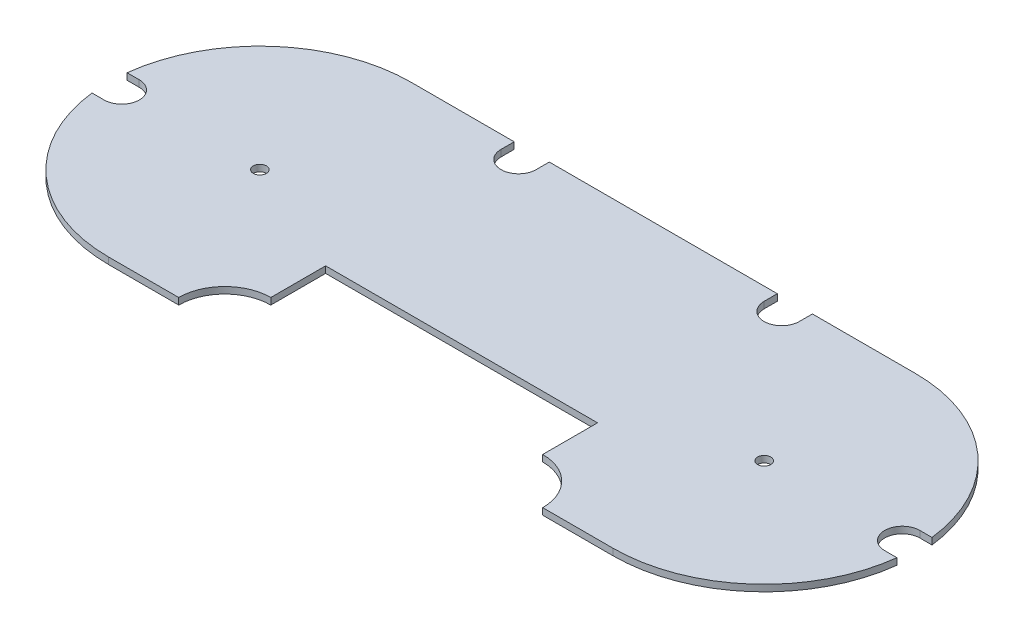
ISO-10303-21;
HEADER;
FILE_DESCRIPTION(('STEP AP214'),'2;1');
FILE_NAME('part.step','',(''),(''),'','','');
FILE_SCHEMA(('AUTOMOTIVE_DESIGN { 1 0 10303 214 1 1 1 1 }'));
ENDSEC;
DATA;
#1=APPLICATION_CONTEXT('core data for automotive mechanical design processes');
#2=APPLICATION_PROTOCOL_DEFINITION('international standard','automotive_design',2000,#1);
#3=PRODUCT_CONTEXT('',#1,'mechanical');
#4=PRODUCT('Part','Part','',(#3));
#5=PRODUCT_RELATED_PRODUCT_CATEGORY('part','',(#4));
#6=PRODUCT_DEFINITION_FORMATION('','',#4);
#7=PRODUCT_DEFINITION_CONTEXT('part definition',#1,'design');
#8=PRODUCT_DEFINITION('design','',#6,#7);
#9=PRODUCT_DEFINITION_SHAPE('','',#8);
#10=(LENGTH_UNIT() NAMED_UNIT(*) SI_UNIT(.MILLI.,.METRE.));
#11=(NAMED_UNIT(*) PLANE_ANGLE_UNIT() SI_UNIT($,.RADIAN.));
#12=(NAMED_UNIT(*) SI_UNIT($,.STERADIAN.) SOLID_ANGLE_UNIT());
#13=UNCERTAINTY_MEASURE_WITH_UNIT(LENGTH_MEASURE(1.E-05),#10,'distance_accuracy_value','');
#14=(GEOMETRIC_REPRESENTATION_CONTEXT(3) GLOBAL_UNCERTAINTY_ASSIGNED_CONTEXT((#13)) GLOBAL_UNIT_ASSIGNED_CONTEXT((#10,
#11,#12)) REPRESENTATION_CONTEXT('',''));
#15=CARTESIAN_POINT('',(0.,0.,0.));
#16=DIRECTION('',(0.,0.,1.));
#17=DIRECTION('',(1.,0.,0.));
#18=AXIS2_PLACEMENT_3D('',#15,#16,#17);
#19=CARTESIAN_POINT('',(30.,1.5,-31.5));
#20=DIRECTION('',(0.,-1.,0.));
#21=DIRECTION('',(0.,0.,-1.));
#22=AXIS2_PLACEMENT_3D('',#19,#20,#21);
#23=PLANE('',#22);
#24=DIRECTION('',(-1.,0.,0.));
#25=VECTOR('',#24,1.);
#26=CARTESIAN_POINT('',(0.,1.5,-34.5));
#27=LINE('',#26,#25);
#28=CARTESIAN_POINT('',(26.,1.5,-34.5));
#29=VERTEX_POINT('',#28);
#30=CARTESIAN_POINT('',(-26.,1.5,-34.5));
#31=VERTEX_POINT('',#30);
#32=EDGE_CURVE('E146',#29,#31,#27,.T.);
#33=ORIENTED_EDGE('',*,*,#32,.T.);
#34=DIRECTION('',(0.,0.,1.));
#35=VECTOR('',#34,1.);
#36=CARTESIAN_POINT('',(-26.,1.5,-31.5));
#37=LINE('',#36,#35);
#38=CARTESIAN_POINT('',(-26.,1.5,-31.5));
#39=VERTEX_POINT('',#38);
#40=EDGE_CURVE('E427',#31,#39,#37,.T.);
#41=ORIENTED_EDGE('',*,*,#40,.T.);
#42=CARTESIAN_POINT('',(-30.,1.5,-31.5));
#43=DIRECTION('',(0.,-1.,0.));
#44=DIRECTION('',(0.,0.,-1.));
#45=AXIS2_PLACEMENT_3D('',#42,#43,#44);
#46=CIRCLE('',#45,4.);
#47=CARTESIAN_POINT('',(-34.,1.5,-31.5));
#48=VERTEX_POINT('',#47);
#49=EDGE_CURVE('E358',#39,#48,#46,.T.);
#50=ORIENTED_EDGE('',*,*,#49,.T.);
#51=DIRECTION('',(0.,0.,-1.));
#52=VECTOR('',#51,1.);
#53=CARTESIAN_POINT('',(-34.,1.5,-34.5));
#54=LINE('',#53,#52);
#55=CARTESIAN_POINT('',(-34.,1.5,-34.5));
#56=VERTEX_POINT('',#55);
#57=EDGE_CURVE('E377',#48,#56,#54,.T.);
#58=ORIENTED_EDGE('',*,*,#57,.T.);
#59=DIRECTION('',(-1.,0.,0.));
#60=VECTOR('',#59,1.);
#61=CARTESIAN_POINT('',(-34.,1.5,-34.5));
#62=LINE('',#61,#60);
#63=CARTESIAN_POINT('',(-57.5,1.5,-34.5));
#64=VERTEX_POINT('',#63);
#65=EDGE_CURVE('E374',#56,#64,#62,.T.);
#66=ORIENTED_EDGE('',*,*,#65,.T.);
#67=CARTESIAN_POINT('',(-57.5,1.5,0.));
#68=DIRECTION('',(0.,1.,0.));
#69=DIRECTION('',(0.,0.,1.));
#70=AXIS2_PLACEMENT_3D('',#67,#68,#69);
#71=CIRCLE('',#70,34.5);
#72=CARTESIAN_POINT('',(-91.7673313813609,1.5,-4.00000000000002));
#73=VERTEX_POINT('',#72);
#74=EDGE_CURVE('E376',#64,#73,#71,.T.);
#75=ORIENTED_EDGE('',*,*,#74,.T.);
#76=DIRECTION('',(1.,0.,0.));
#77=VECTOR('',#76,1.);
#78=CARTESIAN_POINT('',(-91.7673313813609,1.5,-4.));
#79=LINE('',#78,#77);
#80=CARTESIAN_POINT('',(-89.,1.5,-4.));
#81=VERTEX_POINT('',#80);
#82=EDGE_CURVE('E379',#73,#81,#79,.T.);
#83=ORIENTED_EDGE('',*,*,#82,.T.);
#84=CARTESIAN_POINT('',(-89.,1.5,0.));
#85=DIRECTION('',(0.,-1.,0.));
#86=DIRECTION('',(0.,0.,-1.));
#87=AXIS2_PLACEMENT_3D('',#84,#85,#86);
#88=CIRCLE('',#87,4.);
#89=CARTESIAN_POINT('',(-89.,1.5,4.));
#90=VERTEX_POINT('',#89);
#91=EDGE_CURVE('E385',#81,#90,#88,.T.);
#92=ORIENTED_EDGE('',*,*,#91,.T.);
#93=DIRECTION('',(-1.,0.,0.));
#94=VECTOR('',#93,1.);
#95=CARTESIAN_POINT('',(-91.7673313813609,1.5,4.));
#96=LINE('',#95,#94);
#97=CARTESIAN_POINT('',(-91.7673313813609,1.5,4.));
#98=VERTEX_POINT('',#97);
#99=EDGE_CURVE('E387',#90,#98,#96,.T.);
#100=ORIENTED_EDGE('',*,*,#99,.T.);
#101=CARTESIAN_POINT('',(-57.5,1.5,0.));
#102=DIRECTION('',(0.,1.,0.));
#103=DIRECTION('',(0.,0.,1.));
#104=AXIS2_PLACEMENT_3D('',#101,#102,#103);
#105=CIRCLE('',#104,34.5);
#106=CARTESIAN_POINT('',(-57.5,1.5,34.5));
#107=VERTEX_POINT('',#106);
#108=EDGE_CURVE('E389',#98,#107,#105,.T.);
#109=ORIENTED_EDGE('',*,*,#108,.T.);
#110=DIRECTION('',(1.,0.,0.));
#111=VECTOR('',#110,1.);
#112=CARTESIAN_POINT('',(-57.5,1.5,34.5));
#113=LINE('',#112,#111);
#114=CARTESIAN_POINT('',(-41.5,1.5,34.5));
#115=VERTEX_POINT('',#114);
#116=EDGE_CURVE('E391',#107,#115,#113,.T.);
#117=ORIENTED_EDGE('',*,*,#116,.T.);
#118=CARTESIAN_POINT('',(-31.,1.5,34.5));
#119=DIRECTION('',(0.,-1.,0.));
#120=DIRECTION('',(0.,0.,-1.));
#121=AXIS2_PLACEMENT_3D('',#118,#119,#120);
#122=CIRCLE('',#121,10.5);
#123=CARTESIAN_POINT('',(-31.,1.5,24.));
#124=VERTEX_POINT('',#123);
#125=EDGE_CURVE('E393',#115,#124,#122,.T.);
#126=ORIENTED_EDGE('',*,*,#125,.T.);
#127=DIRECTION('',(0.,0.,-1.));
#128=VECTOR('',#127,1.);
#129=CARTESIAN_POINT('',(-31.,1.5,24.));
#130=LINE('',#129,#128);
#131=CARTESIAN_POINT('',(-31.,1.5,11.5));
#132=VERTEX_POINT('',#131);
#133=EDGE_CURVE('E395',#124,#132,#130,.T.);
#134=ORIENTED_EDGE('',*,*,#133,.T.);
#135=DIRECTION('',(1.,0.,0.));
#136=VECTOR('',#135,1.);
#137=CARTESIAN_POINT('',(-31.,1.5,11.5));
#138=LINE('',#137,#136);
#139=CARTESIAN_POINT('',(31.,1.5,11.5));
#140=VERTEX_POINT('',#139);
#141=EDGE_CURVE('E397',#132,#140,#138,.T.);
#142=ORIENTED_EDGE('',*,*,#141,.T.);
#143=DIRECTION('',(0.,0.,1.));
#144=VECTOR('',#143,1.);
#145=CARTESIAN_POINT('',(31.,1.5,11.5));
#146=LINE('',#145,#144);
#147=CARTESIAN_POINT('',(31.,1.5,24.));
#148=VERTEX_POINT('',#147);
#149=EDGE_CURVE('E399',#140,#148,#146,.T.);
#150=ORIENTED_EDGE('',*,*,#149,.T.);
#151=CARTESIAN_POINT('',(31.,1.5,34.5));
#152=DIRECTION('',(0.,-1.,0.));
#153=DIRECTION('',(0.,0.,-1.));
#154=AXIS2_PLACEMENT_3D('',#151,#152,#153);
#155=CIRCLE('',#154,10.5);
#156=CARTESIAN_POINT('',(41.5,1.5,34.5));
#157=VERTEX_POINT('',#156);
#158=EDGE_CURVE('E401',#148,#157,#155,.T.);
#159=ORIENTED_EDGE('',*,*,#158,.T.);
#160=DIRECTION('',(1.,0.,0.));
#161=VECTOR('',#160,1.);
#162=CARTESIAN_POINT('',(41.5,1.5,34.5));
#163=LINE('',#162,#161);
#164=CARTESIAN_POINT('',(57.5,1.5,34.5));
#165=VERTEX_POINT('',#164);
#166=EDGE_CURVE('E403',#157,#165,#163,.T.);
#167=ORIENTED_EDGE('',*,*,#166,.T.);
#168=CARTESIAN_POINT('',(57.5,1.5,0.));
#169=DIRECTION('',(0.,1.,0.));
#170=DIRECTION('',(0.,0.,-1.));
#171=AXIS2_PLACEMENT_3D('',#168,#169,#170);
#172=CIRCLE('',#171,34.5);
#173=CARTESIAN_POINT('',(91.7673313813609,1.5,4.));
#174=VERTEX_POINT('',#173);
#175=EDGE_CURVE('E405',#165,#174,#172,.T.);
#176=ORIENTED_EDGE('',*,*,#175,.T.);
#177=DIRECTION('',(-1.,0.,0.));
#178=VECTOR('',#177,1.);
#179=CARTESIAN_POINT('',(91.7673313813609,1.5,4.));
#180=LINE('',#179,#178);
#181=CARTESIAN_POINT('',(89.,1.5,4.));
#182=VERTEX_POINT('',#181);
#183=EDGE_CURVE('E407',#174,#182,#180,.T.);
#184=ORIENTED_EDGE('',*,*,#183,.T.);
#185=CARTESIAN_POINT('',(89.,1.5,0.));
#186=DIRECTION('',(0.,-1.,0.));
#187=DIRECTION('',(0.,0.,1.));
#188=AXIS2_PLACEMENT_3D('',#185,#186,#187);
#189=CIRCLE('',#188,4.);
#190=CARTESIAN_POINT('',(89.,1.5,-4.));
#191=VERTEX_POINT('',#190);
#192=EDGE_CURVE('E409',#182,#191,#189,.T.);
#193=ORIENTED_EDGE('',*,*,#192,.T.);
#194=DIRECTION('',(1.,0.,0.));
#195=VECTOR('',#194,1.);
#196=CARTESIAN_POINT('',(91.7673313813609,1.5,-4.));
#197=LINE('',#196,#195);
#198=CARTESIAN_POINT('',(91.7673313813609,1.5,-4.));
#199=VERTEX_POINT('',#198);
#200=EDGE_CURVE('E411',#191,#199,#197,.T.);
#201=ORIENTED_EDGE('',*,*,#200,.T.);
#202=CARTESIAN_POINT('',(57.5,1.5,0.));
#203=DIRECTION('',(0.,1.,0.));
#204=DIRECTION('',(0.,0.,-1.));
#205=AXIS2_PLACEMENT_3D('',#202,#203,#204);
#206=CIRCLE('',#205,34.5);
#207=CARTESIAN_POINT('',(57.5,1.5,-34.5));
#208=VERTEX_POINT('',#207);
#209=EDGE_CURVE('E413',#199,#208,#206,.T.);
#210=ORIENTED_EDGE('',*,*,#209,.T.);
#211=DIRECTION('',(-1.,0.,0.));
#212=VECTOR('',#211,1.);
#213=CARTESIAN_POINT('',(34.,1.5,-34.5));
#214=LINE('',#213,#212);
#215=CARTESIAN_POINT('',(34.,1.5,-34.5));
#216=VERTEX_POINT('',#215);
#217=EDGE_CURVE('E220',#208,#216,#214,.T.);
#218=ORIENTED_EDGE('',*,*,#217,.T.);
#219=DIRECTION('',(0.,0.,1.));
#220=VECTOR('',#219,1.);
#221=CARTESIAN_POINT('',(34.,1.5,-34.5));
#222=LINE('',#221,#220);
#223=CARTESIAN_POINT('',(34.,1.5,-31.5));
#224=VERTEX_POINT('',#223);
#225=EDGE_CURVE('E214',#216,#224,#222,.T.);
#226=ORIENTED_EDGE('',*,*,#225,.T.);
#227=CARTESIAN_POINT('',(30.,1.5,-31.5));
#228=DIRECTION('',(0.,-1.,0.));
#229=DIRECTION('',(0.,0.,-1.));
#230=AXIS2_PLACEMENT_3D('',#227,#228,#229);
#231=CIRCLE('',#230,4.);
#232=CARTESIAN_POINT('',(26.,1.5,-31.5));
#233=VERTEX_POINT('',#232);
#234=EDGE_CURVE('E218',#224,#233,#231,.T.);
#235=ORIENTED_EDGE('',*,*,#234,.T.);
#236=DIRECTION('',(0.,0.,-1.));
#237=VECTOR('',#236,1.);
#238=CARTESIAN_POINT('',(26.,1.5,-34.5));
#239=LINE('',#238,#237);
#240=EDGE_CURVE('E50',#233,#29,#239,.T.);
#241=ORIENTED_EDGE('',*,*,#240,.T.);
#242=EDGE_LOOP('',(#33,#41,#50,#58,#66,#75,#83,#92,#100,#109,#117,#126,#134,#142,#150,#159,#167,
#176,#184,#193,#201,#210,#218,#226,#235,#241));
#243=FACE_BOUND('',#242,.T.);
#244=CARTESIAN_POINT('',(-57.5,1.5,0.));
#245=DIRECTION('',(0.,1.,0.));
#246=DIRECTION('',(0.,0.,1.));
#247=AXIS2_PLACEMENT_3D('',#244,#245,#246);
#248=CIRCLE('',#247,1.5);
#249=CARTESIAN_POINT('',(-57.5,1.5,1.5));
#250=VERTEX_POINT('',#249);
#251=EDGE_CURVE('E240',#250,#250,#248,.T.);
#252=ORIENTED_EDGE('',*,*,#251,.F.);
#253=EDGE_LOOP('',(#252));
#254=FACE_BOUND('',#253,.T.);
#255=CARTESIAN_POINT('',(57.5,1.5,0.));
#256=DIRECTION('',(0.,1.,0.));
#257=DIRECTION('',(0.,0.,1.));
#258=AXIS2_PLACEMENT_3D('',#255,#256,#257);
#259=CIRCLE('',#258,1.5);
#260=CARTESIAN_POINT('',(57.5,1.5,1.49999999999997));
#261=VERTEX_POINT('',#260);
#262=EDGE_CURVE('E715',#261,#261,#259,.T.);
#263=ORIENTED_EDGE('',*,*,#262,.F.);
#264=EDGE_LOOP('',(#263));
#265=FACE_BOUND('',#264,.T.);
#266=ADVANCED_FACE('F33',(#243,#254,#265),#23,.F.);
#267=CARTESIAN_POINT('',(30.,0.,-31.5));
#268=DIRECTION('',(0.,-1.,0.));
#269=DIRECTION('',(0.,0.,-1.));
#270=AXIS2_PLACEMENT_3D('',#267,#268,#269);
#271=PLANE('',#270);
#272=CARTESIAN_POINT('',(-57.5,0.,0.));
#273=DIRECTION('',(0.,1.,0.));
#274=DIRECTION('',(0.,0.,1.));
#275=AXIS2_PLACEMENT_3D('',#272,#273,#274);
#276=CIRCLE('',#275,1.5);
#277=CARTESIAN_POINT('',(-57.5,0.,1.5));
#278=VERTEX_POINT('',#277);
#279=EDGE_CURVE('E431',#278,#278,#276,.T.);
#280=ORIENTED_EDGE('',*,*,#279,.T.);
#281=EDGE_LOOP('',(#280));
#282=FACE_BOUND('',#281,.T.);
#283=DIRECTION('',(-1.,0.,0.));
#284=VECTOR('',#283,1.);
#285=CARTESIAN_POINT('',(0.,0.,-34.5));
#286=LINE('',#285,#284);
#287=CARTESIAN_POINT('',(26.,0.,-34.5));
#288=VERTEX_POINT('',#287);
#289=CARTESIAN_POINT('',(-26.,0.,-34.5));
#290=VERTEX_POINT('',#289);
#291=EDGE_CURVE('E140',#288,#290,#286,.T.);
#292=ORIENTED_EDGE('',*,*,#291,.F.);
#293=DIRECTION('',(0.,0.,-1.));
#294=VECTOR('',#293,1.);
#295=CARTESIAN_POINT('',(26.,0.,-34.5));
#296=LINE('',#295,#294);
#297=CARTESIAN_POINT('',(26.,0.,-31.5));
#298=VERTEX_POINT('',#297);
#299=EDGE_CURVE('E286',#298,#288,#296,.T.);
#300=ORIENTED_EDGE('',*,*,#299,.F.);
#301=CARTESIAN_POINT('',(30.,0.,-31.5));
#302=DIRECTION('',(0.,-1.,0.));
#303=DIRECTION('',(0.,0.,-1.));
#304=AXIS2_PLACEMENT_3D('',#301,#302,#303);
#305=CIRCLE('',#304,4.);
#306=CARTESIAN_POINT('',(34.,0.,-31.5));
#307=VERTEX_POINT('',#306);
#308=EDGE_CURVE('E133',#307,#298,#305,.T.);
#309=ORIENTED_EDGE('',*,*,#308,.F.);
#310=DIRECTION('',(0.,0.,1.));
#311=VECTOR('',#310,1.);
#312=CARTESIAN_POINT('',(34.,0.,-34.5));
#313=LINE('',#312,#311);
#314=CARTESIAN_POINT('',(34.,0.,-34.5));
#315=VERTEX_POINT('',#314);
#316=EDGE_CURVE('E228',#315,#307,#313,.T.);
#317=ORIENTED_EDGE('',*,*,#316,.F.);
#318=DIRECTION('',(-1.,0.,0.));
#319=VECTOR('',#318,1.);
#320=CARTESIAN_POINT('',(34.,0.,-34.5));
#321=LINE('',#320,#319);
#322=CARTESIAN_POINT('',(57.5,0.,-34.5));
#323=VERTEX_POINT('',#322);
#324=EDGE_CURVE('E282',#323,#315,#321,.T.);
#325=ORIENTED_EDGE('',*,*,#324,.F.);
#326=CARTESIAN_POINT('',(57.5,0.,0.));
#327=DIRECTION('',(0.,1.,0.));
#328=DIRECTION('',(0.,0.,-1.));
#329=AXIS2_PLACEMENT_3D('',#326,#327,#328);
#330=CIRCLE('',#329,34.5);
#331=CARTESIAN_POINT('',(91.7673313813609,0.,-4.));
#332=VERTEX_POINT('',#331);
#333=EDGE_CURVE('E280',#332,#323,#330,.T.);
#334=ORIENTED_EDGE('',*,*,#333,.F.);
#335=DIRECTION('',(1.,0.,0.));
#336=VECTOR('',#335,1.);
#337=CARTESIAN_POINT('',(91.7673313813609,0.,-4.));
#338=LINE('',#337,#336);
#339=CARTESIAN_POINT('',(89.,0.,-4.));
#340=VERTEX_POINT('',#339);
#341=EDGE_CURVE('E278',#340,#332,#338,.T.);
#342=ORIENTED_EDGE('',*,*,#341,.F.);
#343=CARTESIAN_POINT('',(89.,0.,0.));
#344=DIRECTION('',(0.,-1.,0.));
#345=DIRECTION('',(0.,0.,1.));
#346=AXIS2_PLACEMENT_3D('',#343,#344,#345);
#347=CIRCLE('',#346,4.);
#348=CARTESIAN_POINT('',(89.,0.,4.));
#349=VERTEX_POINT('',#348);
#350=EDGE_CURVE('E276',#349,#340,#347,.T.);
#351=ORIENTED_EDGE('',*,*,#350,.F.);
#352=DIRECTION('',(-1.,0.,0.));
#353=VECTOR('',#352,1.);
#354=CARTESIAN_POINT('',(91.7673313813609,0.,4.));
#355=LINE('',#354,#353);
#356=CARTESIAN_POINT('',(91.7673313813609,0.,4.));
#357=VERTEX_POINT('',#356);
#358=EDGE_CURVE('E274',#357,#349,#355,.T.);
#359=ORIENTED_EDGE('',*,*,#358,.F.);
#360=CARTESIAN_POINT('',(57.5,0.,0.));
#361=DIRECTION('',(0.,1.,0.));
#362=DIRECTION('',(0.,0.,-1.));
#363=AXIS2_PLACEMENT_3D('',#360,#361,#362);
#364=CIRCLE('',#363,34.5);
#365=CARTESIAN_POINT('',(57.5,0.,34.5));
#366=VERTEX_POINT('',#365);
#367=EDGE_CURVE('E272',#366,#357,#364,.T.);
#368=ORIENTED_EDGE('',*,*,#367,.F.);
#369=DIRECTION('',(1.,0.,0.));
#370=VECTOR('',#369,1.);
#371=CARTESIAN_POINT('',(41.5,0.,34.5));
#372=LINE('',#371,#370);
#373=CARTESIAN_POINT('',(41.5,0.,34.5));
#374=VERTEX_POINT('',#373);
#375=EDGE_CURVE('E270',#374,#366,#372,.T.);
#376=ORIENTED_EDGE('',*,*,#375,.F.);
#377=CARTESIAN_POINT('',(31.,0.,34.5));
#378=DIRECTION('',(0.,-1.,0.));
#379=DIRECTION('',(0.,0.,-1.));
#380=AXIS2_PLACEMENT_3D('',#377,#378,#379);
#381=CIRCLE('',#380,10.5);
#382=CARTESIAN_POINT('',(31.,0.,24.));
#383=VERTEX_POINT('',#382);
#384=EDGE_CURVE('E268',#383,#374,#381,.T.);
#385=ORIENTED_EDGE('',*,*,#384,.F.);
#386=DIRECTION('',(0.,0.,1.));
#387=VECTOR('',#386,1.);
#388=CARTESIAN_POINT('',(31.,0.,11.5));
#389=LINE('',#388,#387);
#390=CARTESIAN_POINT('',(31.,0.,11.5));
#391=VERTEX_POINT('',#390);
#392=EDGE_CURVE('E266',#391,#383,#389,.T.);
#393=ORIENTED_EDGE('',*,*,#392,.F.);
#394=DIRECTION('',(1.,0.,0.));
#395=VECTOR('',#394,1.);
#396=CARTESIAN_POINT('',(-31.,0.,11.5));
#397=LINE('',#396,#395);
#398=CARTESIAN_POINT('',(-31.,0.,11.5));
#399=VERTEX_POINT('',#398);
#400=EDGE_CURVE('E264',#399,#391,#397,.T.);
#401=ORIENTED_EDGE('',*,*,#400,.F.);
#402=DIRECTION('',(0.,0.,-1.));
#403=VECTOR('',#402,1.);
#404=CARTESIAN_POINT('',(-31.,0.,24.));
#405=LINE('',#404,#403);
#406=CARTESIAN_POINT('',(-31.,0.,24.));
#407=VERTEX_POINT('',#406);
#408=EDGE_CURVE('E262',#407,#399,#405,.T.);
#409=ORIENTED_EDGE('',*,*,#408,.F.);
#410=CARTESIAN_POINT('',(-31.,0.,34.5));
#411=DIRECTION('',(0.,-1.,0.));
#412=DIRECTION('',(0.,0.,-1.));
#413=AXIS2_PLACEMENT_3D('',#410,#411,#412);
#414=CIRCLE('',#413,10.5);
#415=CARTESIAN_POINT('',(-41.5,0.,34.5));
#416=VERTEX_POINT('',#415);
#417=EDGE_CURVE('E260',#416,#407,#414,.T.);
#418=ORIENTED_EDGE('',*,*,#417,.F.);
#419=DIRECTION('',(1.,0.,0.));
#420=VECTOR('',#419,1.);
#421=CARTESIAN_POINT('',(-57.5,0.,34.5));
#422=LINE('',#421,#420);
#423=CARTESIAN_POINT('',(-57.5,0.,34.5));
#424=VERTEX_POINT('',#423);
#425=EDGE_CURVE('E258',#424,#416,#422,.T.);
#426=ORIENTED_EDGE('',*,*,#425,.F.);
#427=CARTESIAN_POINT('',(-57.5,0.,0.));
#428=DIRECTION('',(0.,1.,0.));
#429=DIRECTION('',(0.,0.,1.));
#430=AXIS2_PLACEMENT_3D('',#427,#428,#429);
#431=CIRCLE('',#430,34.5);
#432=CARTESIAN_POINT('',(-91.7673313813609,0.,4.));
#433=VERTEX_POINT('',#432);
#434=EDGE_CURVE('E256',#433,#424,#431,.T.);
#435=ORIENTED_EDGE('',*,*,#434,.F.);
#436=DIRECTION('',(-1.,0.,0.));
#437=VECTOR('',#436,1.);
#438=CARTESIAN_POINT('',(-91.7673313813609,0.,4.));
#439=LINE('',#438,#437);
#440=CARTESIAN_POINT('',(-89.,0.,4.));
#441=VERTEX_POINT('',#440);
#442=EDGE_CURVE('E254',#441,#433,#439,.T.);
#443=ORIENTED_EDGE('',*,*,#442,.F.);
#444=CARTESIAN_POINT('',(-89.,0.,0.));
#445=DIRECTION('',(0.,-1.,0.));
#446=DIRECTION('',(0.,0.,-1.));
#447=AXIS2_PLACEMENT_3D('',#444,#445,#446);
#448=CIRCLE('',#447,4.);
#449=CARTESIAN_POINT('',(-89.,0.,-4.));
#450=VERTEX_POINT('',#449);
#451=EDGE_CURVE('E252',#450,#441,#448,.T.);
#452=ORIENTED_EDGE('',*,*,#451,.F.);
#453=DIRECTION('',(1.,0.,0.));
#454=VECTOR('',#453,1.);
#455=CARTESIAN_POINT('',(-91.7673313813609,0.,-4.));
#456=LINE('',#455,#454);
#457=CARTESIAN_POINT('',(-91.7673313813609,0.,-4.00000000000002));
#458=VERTEX_POINT('',#457);
#459=EDGE_CURVE('E250',#458,#450,#456,.T.);
#460=ORIENTED_EDGE('',*,*,#459,.F.);
#461=CARTESIAN_POINT('',(-57.5,0.,0.));
#462=DIRECTION('',(0.,1.,0.));
#463=DIRECTION('',(0.,0.,1.));
#464=AXIS2_PLACEMENT_3D('',#461,#462,#463);
#465=CIRCLE('',#464,34.5);
#466=CARTESIAN_POINT('',(-57.5,0.,-34.5));
#467=VERTEX_POINT('',#466);
#468=EDGE_CURVE('E248',#467,#458,#465,.T.);
#469=ORIENTED_EDGE('',*,*,#468,.F.);
#470=DIRECTION('',(-1.,0.,0.));
#471=VECTOR('',#470,1.);
#472=CARTESIAN_POINT('',(-34.,0.,-34.5));
#473=LINE('',#472,#471);
#474=CARTESIAN_POINT('',(-34.,0.,-34.5));
#475=VERTEX_POINT('',#474);
#476=EDGE_CURVE('E246',#475,#467,#473,.T.);
#477=ORIENTED_EDGE('',*,*,#476,.F.);
#478=DIRECTION('',(0.,0.,-1.));
#479=VECTOR('',#478,1.);
#480=CARTESIAN_POINT('',(-34.,0.,-34.5));
#481=LINE('',#480,#479);
#482=CARTESIAN_POINT('',(-34.,0.,-31.5));
#483=VERTEX_POINT('',#482);
#484=EDGE_CURVE('E244',#483,#475,#481,.T.);
#485=ORIENTED_EDGE('',*,*,#484,.F.);
#486=CARTESIAN_POINT('',(-30.,0.,-31.5));
#487=DIRECTION('',(0.,-1.,0.));
#488=DIRECTION('',(0.,0.,-1.));
#489=AXIS2_PLACEMENT_3D('',#486,#487,#488);
#490=CIRCLE('',#489,4.);
#491=CARTESIAN_POINT('',(-26.,0.,-31.5));
#492=VERTEX_POINT('',#491);
#493=EDGE_CURVE('E242',#492,#483,#490,.T.);
#494=ORIENTED_EDGE('',*,*,#493,.F.);
#495=DIRECTION('',(0.,0.,1.));
#496=VECTOR('',#495,1.);
#497=CARTESIAN_POINT('',(-26.,0.,-31.5));
#498=LINE('',#497,#496);
#499=EDGE_CURVE('E239',#290,#492,#498,.T.);
#500=ORIENTED_EDGE('',*,*,#499,.F.);
#501=EDGE_LOOP('',(#292,#300,#309,#317,#325,#334,#342,#351,#359,#368,#376,#385,#393,#401,#409,
#418,#426,#435,#443,#452,#460,#469,#477,#485,#494,#500));
#502=FACE_BOUND('',#501,.T.);
#503=CARTESIAN_POINT('',(57.5,0.,0.));
#504=DIRECTION('',(0.,1.,0.));
#505=DIRECTION('',(0.,0.,1.));
#506=AXIS2_PLACEMENT_3D('',#503,#504,#505);
#507=CIRCLE('',#506,1.5);
#508=CARTESIAN_POINT('',(57.5,0.,1.49999999999997));
#509=VERTEX_POINT('',#508);
#510=EDGE_CURVE('E718',#509,#509,#507,.T.);
#511=ORIENTED_EDGE('',*,*,#510,.T.);
#512=EDGE_LOOP('',(#511));
#513=FACE_BOUND('',#512,.T.);
#514=ADVANCED_FACE('F362',(#282,#502,#513),#271,.T.);
#515=CARTESIAN_POINT('',(0.,1.5,-34.5));
#516=DIRECTION('',(0.,0.,1.));
#517=DIRECTION('',(1.,0.,0.));
#518=AXIS2_PLACEMENT_3D('',#515,#516,#517);
#519=PLANE('',#518);
#520=ORIENTED_EDGE('',*,*,#291,.T.);
#521=DIRECTION('',(0.,-1.,0.));
#522=VECTOR('',#521,1.);
#523=CARTESIAN_POINT('',(-26.,1.5,-34.5));
#524=LINE('',#523,#522);
#525=EDGE_CURVE('E11',#31,#290,#524,.T.);
#526=ORIENTED_EDGE('',*,*,#525,.F.);
#527=ORIENTED_EDGE('',*,*,#32,.F.);
#528=DIRECTION('',(0.,-1.,0.));
#529=VECTOR('',#528,1.);
#530=CARTESIAN_POINT('',(26.,1.5,-34.5));
#531=LINE('',#530,#529);
#532=EDGE_CURVE('E234',#29,#288,#531,.T.);
#533=ORIENTED_EDGE('',*,*,#532,.T.);
#534=EDGE_LOOP('',(#520,#526,#527,#533));
#535=FACE_BOUND('',#534,.T.);
#536=ADVANCED_FACE('F35',(#535),#519,.F.);
#537=CARTESIAN_POINT('',(-26.,1.5,-31.5));
#538=DIRECTION('',(1.,0.,0.));
#539=DIRECTION('',(0.,0.,-1.));
#540=AXIS2_PLACEMENT_3D('',#537,#538,#539);
#541=PLANE('',#540);
#542=ORIENTED_EDGE('',*,*,#499,.T.);
#543=DIRECTION('',(0.,-1.,0.));
#544=VECTOR('',#543,1.);
#545=CARTESIAN_POINT('',(-26.,1.5,-31.5));
#546=LINE('',#545,#544);
#547=EDGE_CURVE('E42',#39,#492,#546,.T.);
#548=ORIENTED_EDGE('',*,*,#547,.F.);
#549=ORIENTED_EDGE('',*,*,#40,.F.);
#550=ORIENTED_EDGE('',*,*,#525,.T.);
#551=EDGE_LOOP('',(#542,#548,#549,#550));
#552=FACE_BOUND('',#551,.T.);
#553=ADVANCED_FACE('F433',(#552),#541,.F.);
#554=CARTESIAN_POINT('',(-30.,1.5,-31.5));
#555=DIRECTION('',(0.,-1.,0.));
#556=DIRECTION('',(0.,0.,-1.));
#557=AXIS2_PLACEMENT_3D('',#554,#555,#556);
#558=CYLINDRICAL_SURFACE('',#557,4.);
#559=ORIENTED_EDGE('',*,*,#493,.T.);
#560=DIRECTION('',(0.,-1.,0.));
#561=VECTOR('',#560,1.);
#562=CARTESIAN_POINT('',(-34.,1.5,-31.5));
#563=LINE('',#562,#561);
#564=EDGE_CURVE('E349',#48,#483,#563,.T.);
#565=ORIENTED_EDGE('',*,*,#564,.F.);
#566=ORIENTED_EDGE('',*,*,#49,.F.);
#567=ORIENTED_EDGE('',*,*,#547,.T.);
#568=EDGE_LOOP('',(#559,#565,#566,#567));
#569=FACE_BOUND('',#568,.T.);
#570=ADVANCED_FACE('F356',(#569),#558,.F.);
#571=CARTESIAN_POINT('',(-34.,1.5,-34.5));
#572=DIRECTION('',(-1.,0.,0.));
#573=DIRECTION('',(0.,0.,1.));
#574=AXIS2_PLACEMENT_3D('',#571,#572,#573);
#575=PLANE('',#574);
#576=ORIENTED_EDGE('',*,*,#484,.T.);
#577=DIRECTION('',(0.,-1.,0.));
#578=VECTOR('',#577,1.);
#579=CARTESIAN_POINT('',(-34.,1.5,-34.5));
#580=LINE('',#579,#578);
#581=EDGE_CURVE('E346',#56,#475,#580,.T.);
#582=ORIENTED_EDGE('',*,*,#581,.F.);
#583=ORIENTED_EDGE('',*,*,#57,.F.);
#584=ORIENTED_EDGE('',*,*,#564,.T.);
#585=EDGE_LOOP('',(#576,#582,#583,#584));
#586=FACE_BOUND('',#585,.T.);
#587=ADVANCED_FACE('F368',(#586),#575,.F.);
#588=CARTESIAN_POINT('',(-34.,1.5,-34.5));
#589=DIRECTION('',(0.,0.,1.));
#590=DIRECTION('',(1.,0.,0.));
#591=AXIS2_PLACEMENT_3D('',#588,#589,#590);
#592=PLANE('',#591);
#593=ORIENTED_EDGE('',*,*,#476,.T.);
#594=DIRECTION('',(0.,-1.,0.));
#595=VECTOR('',#594,1.);
#596=CARTESIAN_POINT('',(-57.5,1.5,-34.5));
#597=LINE('',#596,#595);
#598=EDGE_CURVE('E343',#64,#467,#597,.T.);
#599=ORIENTED_EDGE('',*,*,#598,.F.);
#600=ORIENTED_EDGE('',*,*,#65,.F.);
#601=ORIENTED_EDGE('',*,*,#581,.T.);
#602=EDGE_LOOP('',(#593,#599,#600,#601));
#603=FACE_BOUND('',#602,.T.);
#604=ADVANCED_FACE('F372',(#603),#592,.F.);
#605=CARTESIAN_POINT('',(-57.5,1.5,0.));
#606=DIRECTION('',(0.,-1.,0.));
#607=DIRECTION('',(0.,0.,-1.));
#608=AXIS2_PLACEMENT_3D('',#605,#606,#607);
#609=CYLINDRICAL_SURFACE('',#608,34.5);
#610=ORIENTED_EDGE('',*,*,#468,.T.);
#611=DIRECTION('',(0.,-1.,0.));
#612=VECTOR('',#611,1.);
#613=CARTESIAN_POINT('',(-91.7673313813609,1.5,-4.00000000000002));
#614=LINE('',#613,#612);
#615=EDGE_CURVE('E340',#73,#458,#614,.T.);
#616=ORIENTED_EDGE('',*,*,#615,.F.);
#617=ORIENTED_EDGE('',*,*,#74,.F.);
#618=ORIENTED_EDGE('',*,*,#598,.T.);
#619=EDGE_LOOP('',(#610,#616,#617,#618));
#620=FACE_BOUND('',#619,.T.);
#621=ADVANCED_FACE('F520',(#620),#609,.T.);
#622=CARTESIAN_POINT('',(-91.7673313813609,1.5,-4.));
#623=DIRECTION('',(0.,0.,-1.));
#624=DIRECTION('',(-1.,0.,0.));
#625=AXIS2_PLACEMENT_3D('',#622,#623,#624);
#626=PLANE('',#625);
#627=ORIENTED_EDGE('',*,*,#459,.T.);
#628=DIRECTION('',(0.,-1.,0.));
#629=VECTOR('',#628,1.);
#630=CARTESIAN_POINT('',(-89.,1.5,-4.));
#631=LINE('',#630,#629);
#632=EDGE_CURVE('E337',#81,#450,#631,.T.);
#633=ORIENTED_EDGE('',*,*,#632,.F.);
#634=ORIENTED_EDGE('',*,*,#82,.F.);
#635=ORIENTED_EDGE('',*,*,#615,.T.);
#636=EDGE_LOOP('',(#627,#633,#634,#635));
#637=FACE_BOUND('',#636,.T.);
#638=ADVANCED_FACE('F516',(#637),#626,.F.);
#639=CARTESIAN_POINT('',(-89.,1.5,0.));
#640=DIRECTION('',(0.,-1.,0.));
#641=DIRECTION('',(0.,0.,-1.));
#642=AXIS2_PLACEMENT_3D('',#639,#640,#641);
#643=CYLINDRICAL_SURFACE('',#642,4.);
#644=ORIENTED_EDGE('',*,*,#451,.T.);
#645=DIRECTION('',(0.,-1.,0.));
#646=VECTOR('',#645,1.);
#647=CARTESIAN_POINT('',(-89.,1.5,4.));
#648=LINE('',#647,#646);
#649=EDGE_CURVE('E334',#90,#441,#648,.T.);
#650=ORIENTED_EDGE('',*,*,#649,.F.);
#651=ORIENTED_EDGE('',*,*,#91,.F.);
#652=ORIENTED_EDGE('',*,*,#632,.T.);
#653=EDGE_LOOP('',(#644,#650,#651,#652));
#654=FACE_BOUND('',#653,.T.);
#655=ADVANCED_FACE('F512',(#654),#643,.F.);
#656=CARTESIAN_POINT('',(-91.7673313813609,1.5,4.));
#657=DIRECTION('',(0.,0.,1.));
#658=DIRECTION('',(1.,0.,0.));
#659=AXIS2_PLACEMENT_3D('',#656,#657,#658);
#660=PLANE('',#659);
#661=ORIENTED_EDGE('',*,*,#442,.T.);
#662=DIRECTION('',(0.,-1.,0.));
#663=VECTOR('',#662,1.);
#664=CARTESIAN_POINT('',(-91.7673313813609,1.5,4.));
#665=LINE('',#664,#663);
#666=EDGE_CURVE('E331',#98,#433,#665,.T.);
#667=ORIENTED_EDGE('',*,*,#666,.F.);
#668=ORIENTED_EDGE('',*,*,#99,.F.);
#669=ORIENTED_EDGE('',*,*,#649,.T.);
#670=EDGE_LOOP('',(#661,#667,#668,#669));
#671=FACE_BOUND('',#670,.T.);
#672=ADVANCED_FACE('F508',(#671),#660,.F.);
#673=CARTESIAN_POINT('',(-57.5,1.5,0.));
#674=DIRECTION('',(0.,-1.,0.));
#675=DIRECTION('',(0.,0.,-1.));
#676=AXIS2_PLACEMENT_3D('',#673,#674,#675);
#677=CYLINDRICAL_SURFACE('',#676,34.5);
#678=ORIENTED_EDGE('',*,*,#434,.T.);
#679=DIRECTION('',(0.,-1.,0.));
#680=VECTOR('',#679,1.);
#681=CARTESIAN_POINT('',(-57.5,1.5,34.5));
#682=LINE('',#681,#680);
#683=EDGE_CURVE('E328',#107,#424,#682,.T.);
#684=ORIENTED_EDGE('',*,*,#683,.F.);
#685=ORIENTED_EDGE('',*,*,#108,.F.);
#686=ORIENTED_EDGE('',*,*,#666,.T.);
#687=EDGE_LOOP('',(#678,#684,#685,#686));
#688=FACE_BOUND('',#687,.T.);
#689=ADVANCED_FACE('F504',(#688),#677,.T.);
#690=CARTESIAN_POINT('',(-57.5,1.5,34.5));
#691=DIRECTION('',(0.,0.,-1.));
#692=DIRECTION('',(-1.,0.,0.));
#693=AXIS2_PLACEMENT_3D('',#690,#691,#692);
#694=PLANE('',#693);
#695=ORIENTED_EDGE('',*,*,#425,.T.);
#696=DIRECTION('',(0.,-1.,0.));
#697=VECTOR('',#696,1.);
#698=CARTESIAN_POINT('',(-41.5,1.5,34.5));
#699=LINE('',#698,#697);
#700=EDGE_CURVE('E325',#115,#416,#699,.T.);
#701=ORIENTED_EDGE('',*,*,#700,.F.);
#702=ORIENTED_EDGE('',*,*,#116,.F.);
#703=ORIENTED_EDGE('',*,*,#683,.T.);
#704=EDGE_LOOP('',(#695,#701,#702,#703));
#705=FACE_BOUND('',#704,.T.);
#706=ADVANCED_FACE('F500',(#705),#694,.F.);
#707=CARTESIAN_POINT('',(-31.,1.5,34.5));
#708=DIRECTION('',(0.,-1.,0.));
#709=DIRECTION('',(0.,0.,-1.));
#710=AXIS2_PLACEMENT_3D('',#707,#708,#709);
#711=CYLINDRICAL_SURFACE('',#710,10.5);
#712=ORIENTED_EDGE('',*,*,#417,.T.);
#713=DIRECTION('',(0.,-1.,0.));
#714=VECTOR('',#713,1.);
#715=CARTESIAN_POINT('',(-31.,1.5,24.));
#716=LINE('',#715,#714);
#717=EDGE_CURVE('E322',#124,#407,#716,.T.);
#718=ORIENTED_EDGE('',*,*,#717,.F.);
#719=ORIENTED_EDGE('',*,*,#125,.F.);
#720=ORIENTED_EDGE('',*,*,#700,.T.);
#721=EDGE_LOOP('',(#712,#718,#719,#720));
#722=FACE_BOUND('',#721,.T.);
#723=ADVANCED_FACE('F496',(#722),#711,.F.);
#724=CARTESIAN_POINT('',(-31.,1.5,24.));
#725=DIRECTION('',(-1.,0.,0.));
#726=DIRECTION('',(0.,0.,1.));
#727=AXIS2_PLACEMENT_3D('',#724,#725,#726);
#728=PLANE('',#727);
#729=ORIENTED_EDGE('',*,*,#408,.T.);
#730=DIRECTION('',(0.,-1.,0.));
#731=VECTOR('',#730,1.);
#732=CARTESIAN_POINT('',(-31.,1.5,11.5));
#733=LINE('',#732,#731);
#734=EDGE_CURVE('E319',#132,#399,#733,.T.);
#735=ORIENTED_EDGE('',*,*,#734,.F.);
#736=ORIENTED_EDGE('',*,*,#133,.F.);
#737=ORIENTED_EDGE('',*,*,#717,.T.);
#738=EDGE_LOOP('',(#729,#735,#736,#737));
#739=FACE_BOUND('',#738,.T.);
#740=ADVANCED_FACE('F492',(#739),#728,.F.);
#741=CARTESIAN_POINT('',(-31.,1.5,11.5));
#742=DIRECTION('',(0.,0.,-1.));
#743=DIRECTION('',(-1.,0.,0.));
#744=AXIS2_PLACEMENT_3D('',#741,#742,#743);
#745=PLANE('',#744);
#746=ORIENTED_EDGE('',*,*,#400,.T.);
#747=DIRECTION('',(0.,-1.,0.));
#748=VECTOR('',#747,1.);
#749=CARTESIAN_POINT('',(31.,1.5,11.5));
#750=LINE('',#749,#748);
#751=EDGE_CURVE('E316',#140,#391,#750,.T.);
#752=ORIENTED_EDGE('',*,*,#751,.F.);
#753=ORIENTED_EDGE('',*,*,#141,.F.);
#754=ORIENTED_EDGE('',*,*,#734,.T.);
#755=EDGE_LOOP('',(#746,#752,#753,#754));
#756=FACE_BOUND('',#755,.T.);
#757=ADVANCED_FACE('F488',(#756),#745,.F.);
#758=CARTESIAN_POINT('',(31.,1.5,11.5));
#759=DIRECTION('',(1.,0.,0.));
#760=DIRECTION('',(0.,0.,-1.));
#761=AXIS2_PLACEMENT_3D('',#758,#759,#760);
#762=PLANE('',#761);
#763=ORIENTED_EDGE('',*,*,#392,.T.);
#764=DIRECTION('',(0.,-1.,0.));
#765=VECTOR('',#764,1.);
#766=CARTESIAN_POINT('',(31.,1.5,24.));
#767=LINE('',#766,#765);
#768=EDGE_CURVE('E313',#148,#383,#767,.T.);
#769=ORIENTED_EDGE('',*,*,#768,.F.);
#770=ORIENTED_EDGE('',*,*,#149,.F.);
#771=ORIENTED_EDGE('',*,*,#751,.T.);
#772=EDGE_LOOP('',(#763,#769,#770,#771));
#773=FACE_BOUND('',#772,.T.);
#774=ADVANCED_FACE('F484',(#773),#762,.F.);
#775=CARTESIAN_POINT('',(31.,1.5,34.5));
#776=DIRECTION('',(0.,-1.,0.));
#777=DIRECTION('',(0.,0.,-1.));
#778=AXIS2_PLACEMENT_3D('',#775,#776,#777);
#779=CYLINDRICAL_SURFACE('',#778,10.5);
#780=ORIENTED_EDGE('',*,*,#384,.T.);
#781=DIRECTION('',(0.,-1.,0.));
#782=VECTOR('',#781,1.);
#783=CARTESIAN_POINT('',(41.5,1.5,34.5));
#784=LINE('',#783,#782);
#785=EDGE_CURVE('E310',#157,#374,#784,.T.);
#786=ORIENTED_EDGE('',*,*,#785,.F.);
#787=ORIENTED_EDGE('',*,*,#158,.F.);
#788=ORIENTED_EDGE('',*,*,#768,.T.);
#789=EDGE_LOOP('',(#780,#786,#787,#788));
#790=FACE_BOUND('',#789,.T.);
#791=ADVANCED_FACE('F480',(#790),#779,.F.);
#792=CARTESIAN_POINT('',(41.5,1.5,34.5));
#793=DIRECTION('',(0.,0.,-1.));
#794=DIRECTION('',(-1.,0.,0.));
#795=AXIS2_PLACEMENT_3D('',#792,#793,#794);
#796=PLANE('',#795);
#797=ORIENTED_EDGE('',*,*,#375,.T.);
#798=DIRECTION('',(0.,-1.,0.));
#799=VECTOR('',#798,1.);
#800=CARTESIAN_POINT('',(57.5,1.5,34.5));
#801=LINE('',#800,#799);
#802=EDGE_CURVE('E307',#165,#366,#801,.T.);
#803=ORIENTED_EDGE('',*,*,#802,.F.);
#804=ORIENTED_EDGE('',*,*,#166,.F.);
#805=ORIENTED_EDGE('',*,*,#785,.T.);
#806=EDGE_LOOP('',(#797,#803,#804,#805));
#807=FACE_BOUND('',#806,.T.);
#808=ADVANCED_FACE('F476',(#807),#796,.F.);
#809=CARTESIAN_POINT('',(57.5,1.5,0.));
#810=DIRECTION('',(0.,-1.,0.));
#811=DIRECTION('',(0.,0.,-1.));
#812=AXIS2_PLACEMENT_3D('',#809,#810,#811);
#813=CYLINDRICAL_SURFACE('',#812,34.5);
#814=ORIENTED_EDGE('',*,*,#367,.T.);
#815=DIRECTION('',(0.,-1.,0.));
#816=VECTOR('',#815,1.);
#817=CARTESIAN_POINT('',(91.7673313813609,1.5,4.));
#818=LINE('',#817,#816);
#819=EDGE_CURVE('E304',#174,#357,#818,.T.);
#820=ORIENTED_EDGE('',*,*,#819,.F.);
#821=ORIENTED_EDGE('',*,*,#175,.F.);
#822=ORIENTED_EDGE('',*,*,#802,.T.);
#823=EDGE_LOOP('',(#814,#820,#821,#822));
#824=FACE_BOUND('',#823,.T.);
#825=ADVANCED_FACE('F472',(#824),#813,.T.);
#826=CARTESIAN_POINT('',(91.7673313813609,1.5,4.));
#827=DIRECTION('',(0.,0.,1.));
#828=DIRECTION('',(1.,0.,0.));
#829=AXIS2_PLACEMENT_3D('',#826,#827,#828);
#830=PLANE('',#829);
#831=ORIENTED_EDGE('',*,*,#358,.T.);
#832=DIRECTION('',(0.,-1.,0.));
#833=VECTOR('',#832,1.);
#834=CARTESIAN_POINT('',(89.,1.5,4.));
#835=LINE('',#834,#833);
#836=EDGE_CURVE('E301',#182,#349,#835,.T.);
#837=ORIENTED_EDGE('',*,*,#836,.F.);
#838=ORIENTED_EDGE('',*,*,#183,.F.);
#839=ORIENTED_EDGE('',*,*,#819,.T.);
#840=EDGE_LOOP('',(#831,#837,#838,#839));
#841=FACE_BOUND('',#840,.T.);
#842=ADVANCED_FACE('F468',(#841),#830,.F.);
#843=CARTESIAN_POINT('',(89.,1.5,0.));
#844=DIRECTION('',(0.,-1.,0.));
#845=DIRECTION('',(0.,0.,-1.));
#846=AXIS2_PLACEMENT_3D('',#843,#844,#845);
#847=CYLINDRICAL_SURFACE('',#846,4.);
#848=ORIENTED_EDGE('',*,*,#350,.T.);
#849=DIRECTION('',(0.,-1.,0.));
#850=VECTOR('',#849,1.);
#851=CARTESIAN_POINT('',(89.,1.5,-4.));
#852=LINE('',#851,#850);
#853=EDGE_CURVE('E298',#191,#340,#852,.T.);
#854=ORIENTED_EDGE('',*,*,#853,.F.);
#855=ORIENTED_EDGE('',*,*,#192,.F.);
#856=ORIENTED_EDGE('',*,*,#836,.T.);
#857=EDGE_LOOP('',(#848,#854,#855,#856));
#858=FACE_BOUND('',#857,.T.);
#859=ADVANCED_FACE('F464',(#858),#847,.F.);
#860=CARTESIAN_POINT('',(91.7673313813609,1.5,-4.));
#861=DIRECTION('',(0.,0.,-1.));
#862=DIRECTION('',(-1.,0.,0.));
#863=AXIS2_PLACEMENT_3D('',#860,#861,#862);
#864=PLANE('',#863);
#865=ORIENTED_EDGE('',*,*,#341,.T.);
#866=DIRECTION('',(0.,-1.,0.));
#867=VECTOR('',#866,1.);
#868=CARTESIAN_POINT('',(91.7673313813609,1.5,-4.));
#869=LINE('',#868,#867);
#870=EDGE_CURVE('E295',#199,#332,#869,.T.);
#871=ORIENTED_EDGE('',*,*,#870,.F.);
#872=ORIENTED_EDGE('',*,*,#200,.F.);
#873=ORIENTED_EDGE('',*,*,#853,.T.);
#874=EDGE_LOOP('',(#865,#871,#872,#873));
#875=FACE_BOUND('',#874,.T.);
#876=ADVANCED_FACE('F461',(#875),#864,.F.);
#877=CARTESIAN_POINT('',(57.5,1.5,0.));
#878=DIRECTION('',(0.,-1.,0.));
#879=DIRECTION('',(0.,0.,-1.));
#880=AXIS2_PLACEMENT_3D('',#877,#878,#879);
#881=CYLINDRICAL_SURFACE('',#880,34.5);
#882=ORIENTED_EDGE('',*,*,#333,.T.);
#883=DIRECTION('',(0.,-1.,0.));
#884=VECTOR('',#883,1.);
#885=CARTESIAN_POINT('',(57.5,1.5,-34.5));
#886=LINE('',#885,#884);
#887=EDGE_CURVE('E292',#208,#323,#886,.T.);
#888=ORIENTED_EDGE('',*,*,#887,.F.);
#889=ORIENTED_EDGE('',*,*,#209,.F.);
#890=ORIENTED_EDGE('',*,*,#870,.T.);
#891=EDGE_LOOP('',(#882,#888,#889,#890));
#892=FACE_BOUND('',#891,.T.);
#893=ADVANCED_FACE('F419',(#892),#881,.T.);
#894=CARTESIAN_POINT('',(34.,1.5,-34.5));
#895=DIRECTION('',(0.,0.,1.));
#896=DIRECTION('',(1.,0.,0.));
#897=AXIS2_PLACEMENT_3D('',#894,#895,#896);
#898=PLANE('',#897);
#899=ORIENTED_EDGE('',*,*,#324,.T.);
#900=DIRECTION('',(0.,-1.,0.));
#901=VECTOR('',#900,1.);
#902=CARTESIAN_POINT('',(34.,1.5,-34.5));
#903=LINE('',#902,#901);
#904=EDGE_CURVE('E229',#216,#315,#903,.T.);
#905=ORIENTED_EDGE('',*,*,#904,.F.);
#906=ORIENTED_EDGE('',*,*,#217,.F.);
#907=ORIENTED_EDGE('',*,*,#887,.T.);
#908=EDGE_LOOP('',(#899,#905,#906,#907));
#909=FACE_BOUND('',#908,.T.);
#910=ADVANCED_FACE('F423',(#909),#898,.F.);
#911=CARTESIAN_POINT('',(34.,1.5,-34.5));
#912=DIRECTION('',(1.,0.,0.));
#913=DIRECTION('',(0.,0.,-1.));
#914=AXIS2_PLACEMENT_3D('',#911,#912,#913);
#915=PLANE('',#914);
#916=ORIENTED_EDGE('',*,*,#316,.T.);
#917=DIRECTION('',(0.,-1.,0.));
#918=VECTOR('',#917,1.);
#919=CARTESIAN_POINT('',(34.,1.5,-31.5));
#920=LINE('',#919,#918);
#921=EDGE_CURVE('E225',#224,#307,#920,.T.);
#922=ORIENTED_EDGE('',*,*,#921,.F.);
#923=ORIENTED_EDGE('',*,*,#225,.F.);
#924=ORIENTED_EDGE('',*,*,#904,.T.);
#925=EDGE_LOOP('',(#916,#922,#923,#924));
#926=FACE_BOUND('',#925,.T.);
#927=ADVANCED_FACE('F226',(#926),#915,.F.);
#928=CARTESIAN_POINT('',(30.,1.5,-31.5));
#929=DIRECTION('',(0.,-1.,0.));
#930=DIRECTION('',(0.,0.,-1.));
#931=AXIS2_PLACEMENT_3D('',#928,#929,#930);
#932=CYLINDRICAL_SURFACE('',#931,4.);
#933=ORIENTED_EDGE('',*,*,#308,.T.);
#934=DIRECTION('',(0.,-1.,0.));
#935=VECTOR('',#934,1.);
#936=CARTESIAN_POINT('',(26.,1.5,-31.5));
#937=LINE('',#936,#935);
#938=EDGE_CURVE('E230',#233,#298,#937,.T.);
#939=ORIENTED_EDGE('',*,*,#938,.F.);
#940=ORIENTED_EDGE('',*,*,#234,.F.);
#941=ORIENTED_EDGE('',*,*,#921,.T.);
#942=EDGE_LOOP('',(#933,#939,#940,#941));
#943=FACE_BOUND('',#942,.T.);
#944=ADVANCED_FACE('F232',(#943),#932,.F.);
#945=CARTESIAN_POINT('',(26.,1.5,-34.5));
#946=DIRECTION('',(-1.,0.,0.));
#947=DIRECTION('',(0.,0.,1.));
#948=AXIS2_PLACEMENT_3D('',#945,#946,#947);
#949=PLANE('',#948);
#950=ORIENTED_EDGE('',*,*,#299,.T.);
#951=ORIENTED_EDGE('',*,*,#532,.F.);
#952=ORIENTED_EDGE('',*,*,#240,.F.);
#953=ORIENTED_EDGE('',*,*,#938,.T.);
#954=EDGE_LOOP('',(#950,#951,#952,#953));
#955=FACE_BOUND('',#954,.T.);
#956=ADVANCED_FACE('F425',(#955),#949,.F.);
#957=CARTESIAN_POINT('',(-57.5,1.5,0.));
#958=DIRECTION('',(0.,-1.,0.));
#959=DIRECTION('',(0.,0.,-1.));
#960=AXIS2_PLACEMENT_3D('',#957,#958,#959);
#961=CYLINDRICAL_SURFACE('',#960,1.5);
#962=ORIENTED_EDGE('',*,*,#251,.T.);
#963=EDGE_LOOP('',(#962));
#964=FACE_BOUND('',#963,.T.);
#965=ORIENTED_EDGE('',*,*,#279,.F.);
#966=EDGE_LOOP('',(#965));
#967=FACE_BOUND('',#966,.T.);
#968=ADVANCED_FACE('F448',(#964,#967),#961,.F.);
#969=CARTESIAN_POINT('',(57.5,1.5,0.));
#970=DIRECTION('',(0.,-1.,0.));
#971=DIRECTION('',(0.,0.,-1.));
#972=AXIS2_PLACEMENT_3D('',#969,#970,#971);
#973=CYLINDRICAL_SURFACE('',#972,1.5);
#974=ORIENTED_EDGE('',*,*,#262,.T.);
#975=EDGE_LOOP('',(#974));
#976=FACE_BOUND('',#975,.T.);
#977=ORIENTED_EDGE('',*,*,#510,.F.);
#978=EDGE_LOOP('',(#977));
#979=FACE_BOUND('',#978,.T.);
#980=ADVANCED_FACE('F626',(#976,#979),#973,.F.);
#981=CLOSED_SHELL('',(#266,#514,#536,#553,#570,#587,#604,#621,#638,#655,#672,#689,#706,#723,
#740,#757,#774,#791,#808,#825,#842,#859,#876,#893,#910,#927,#944,#956,#968,#980));
#982=MANIFOLD_SOLID_BREP('B2',#981);
#983=ADVANCED_BREP_SHAPE_REPRESENTATION('',(#18,#982),#14);
#984=SHAPE_DEFINITION_REPRESENTATION(#9,#983);
ENDSEC;
END-ISO-10303-21;
